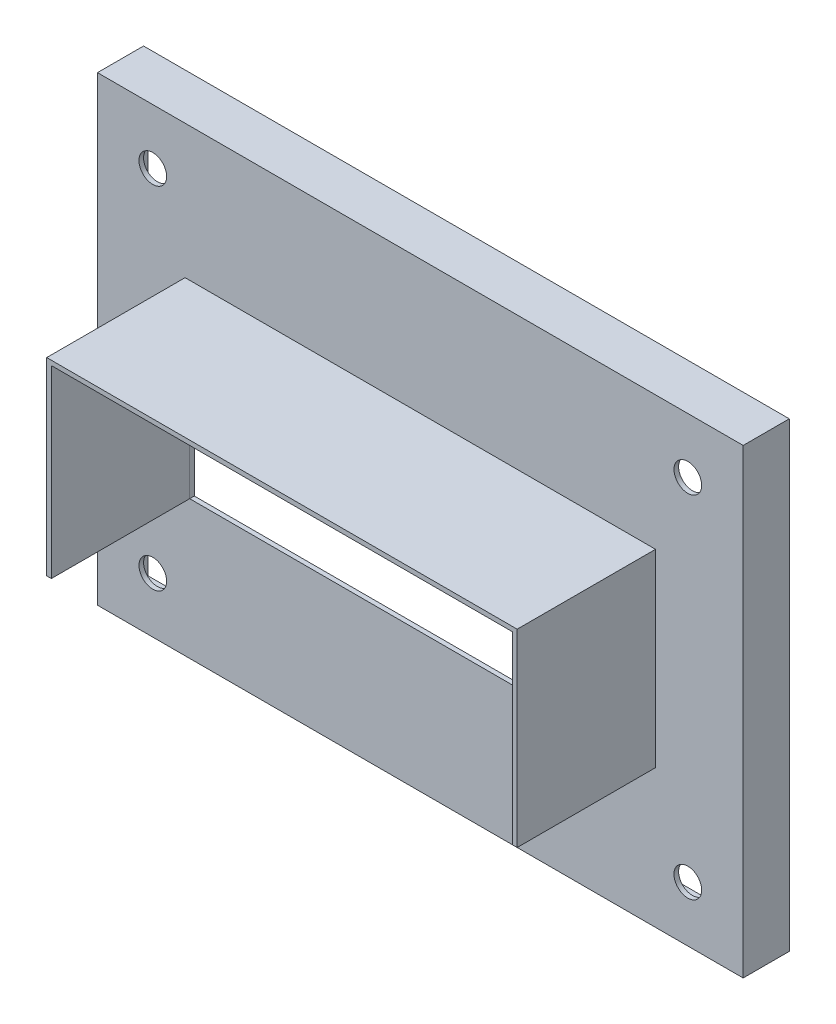
ISO-10303-21;
HEADER;
FILE_DESCRIPTION(('STEP AP214'),'2;1');
FILE_NAME('part.step','',(''),(''),'','','');
FILE_SCHEMA(('AUTOMOTIVE_DESIGN { 1 0 10303 214 1 1 1 1 }'));
ENDSEC;
DATA;
#1=APPLICATION_CONTEXT('core data for automotive mechanical design processes');
#2=APPLICATION_PROTOCOL_DEFINITION('international standard','automotive_design',2000,#1);
#3=PRODUCT_CONTEXT('',#1,'mechanical');
#4=PRODUCT('Part','Part','',(#3));
#5=PRODUCT_RELATED_PRODUCT_CATEGORY('part','',(#4));
#6=PRODUCT_DEFINITION_FORMATION('','',#4);
#7=PRODUCT_DEFINITION_CONTEXT('part definition',#1,'design');
#8=PRODUCT_DEFINITION('design','',#6,#7);
#9=PRODUCT_DEFINITION_SHAPE('','',#8);
#10=(LENGTH_UNIT() NAMED_UNIT(*) SI_UNIT(.MILLI.,.METRE.));
#11=(NAMED_UNIT(*) PLANE_ANGLE_UNIT() SI_UNIT($,.RADIAN.));
#12=(NAMED_UNIT(*) SI_UNIT($,.STERADIAN.) SOLID_ANGLE_UNIT());
#13=UNCERTAINTY_MEASURE_WITH_UNIT(LENGTH_MEASURE(1.E-05),#10,'distance_accuracy_value','');
#14=(GEOMETRIC_REPRESENTATION_CONTEXT(3) GLOBAL_UNCERTAINTY_ASSIGNED_CONTEXT((#13)) GLOBAL_UNIT_ASSIGNED_CONTEXT((#10,
#11,#12)) REPRESENTATION_CONTEXT('',''));
#15=CARTESIAN_POINT('',(0.,0.,0.));
#16=DIRECTION('',(0.,0.,1.));
#17=DIRECTION('',(1.,0.,0.));
#18=AXIS2_PLACEMENT_3D('',#15,#16,#17);
#19=CARTESIAN_POINT('',(-51.,-20.,30.));
#20=DIRECTION('',(0.,1.,0.));
#21=DIRECTION('',(0.,0.,1.));
#22=AXIS2_PLACEMENT_3D('',#19,#20,#21);
#23=PLANE('',#22);
#24=DIRECTION('',(1.,0.,0.));
#25=VECTOR('',#24,1.);
#26=CARTESIAN_POINT('',(-51.,-20.,0.));
#27=LINE('',#26,#25);
#28=CARTESIAN_POINT('',(-51.,-20.,0.));
#29=VERTEX_POINT('',#28);
#30=CARTESIAN_POINT('',(-50.,-20.,0.));
#31=VERTEX_POINT('',#30);
#32=EDGE_CURVE('E143',#29,#31,#27,.T.);
#33=ORIENTED_EDGE('',*,*,#32,.T.);
#34=DIRECTION('',(0.,0.,-1.));
#35=VECTOR('',#34,1.);
#36=CARTESIAN_POINT('',(-50.,-20.,30.));
#37=LINE('',#36,#35);
#38=CARTESIAN_POINT('',(-50.,-20.,30.));
#39=VERTEX_POINT('',#38);
#40=EDGE_CURVE('E12',#39,#31,#37,.T.);
#41=ORIENTED_EDGE('',*,*,#40,.F.);
#42=DIRECTION('',(1.,0.,0.));
#43=VECTOR('',#42,1.);
#44=CARTESIAN_POINT('',(-51.,-20.,30.));
#45=LINE('',#44,#43);
#46=CARTESIAN_POINT('',(-51.,-20.,30.));
#47=VERTEX_POINT('',#46);
#48=EDGE_CURVE('E157',#47,#39,#45,.T.);
#49=ORIENTED_EDGE('',*,*,#48,.F.);
#50=DIRECTION('',(0.,0.,-1.));
#51=VECTOR('',#50,1.);
#52=CARTESIAN_POINT('',(-51.,-20.,30.));
#53=LINE('',#52,#51);
#54=EDGE_CURVE('E139',#47,#29,#53,.T.);
#55=ORIENTED_EDGE('',*,*,#54,.T.);
#56=EDGE_LOOP('',(#33,#41,#49,#55));
#57=FACE_BOUND('',#56,.T.);
#58=ADVANCED_FACE('F47',(#57),#23,.F.);
#59=CARTESIAN_POINT('',(-50.,-20.,30.));
#60=DIRECTION('',(-1.,0.,0.));
#61=DIRECTION('',(0.,0.,1.));
#62=AXIS2_PLACEMENT_3D('',#59,#60,#61);
#63=PLANE('',#62);
#64=DIRECTION('',(0.,1.,0.));
#65=VECTOR('',#64,1.);
#66=CARTESIAN_POINT('',(-50.,-20.,0.));
#67=LINE('',#66,#65);
#68=CARTESIAN_POINT('',(-50.,20.,0.));
#69=VERTEX_POINT('',#68);
#70=EDGE_CURVE('E146',#31,#69,#67,.T.);
#71=ORIENTED_EDGE('',*,*,#70,.T.);
#72=DIRECTION('',(0.,0.,-1.));
#73=VECTOR('',#72,1.);
#74=CARTESIAN_POINT('',(-50.,20.,30.));
#75=LINE('',#74,#73);
#76=CARTESIAN_POINT('',(-50.,20.,30.));
#77=VERTEX_POINT('',#76);
#78=EDGE_CURVE('E55',#77,#69,#75,.T.);
#79=ORIENTED_EDGE('',*,*,#78,.F.);
#80=DIRECTION('',(0.,1.,0.));
#81=VECTOR('',#80,1.);
#82=CARTESIAN_POINT('',(-50.,-20.,30.));
#83=LINE('',#82,#81);
#84=EDGE_CURVE('E106',#39,#77,#83,.T.);
#85=ORIENTED_EDGE('',*,*,#84,.F.);
#86=ORIENTED_EDGE('',*,*,#40,.T.);
#87=EDGE_LOOP('',(#71,#79,#85,#86));
#88=FACE_BOUND('',#87,.T.);
#89=ADVANCED_FACE('F192',(#88),#63,.F.);
#90=CARTESIAN_POINT('',(-50.,20.,30.));
#91=DIRECTION('',(0.,1.,0.));
#92=DIRECTION('',(0.,0.,1.));
#93=AXIS2_PLACEMENT_3D('',#90,#91,#92);
#94=PLANE('',#93);
#95=DIRECTION('',(1.,0.,0.));
#96=VECTOR('',#95,1.);
#97=CARTESIAN_POINT('',(-50.,20.,0.));
#98=LINE('',#97,#96);
#99=CARTESIAN_POINT('',(50.,20.,0.));
#100=VERTEX_POINT('',#99);
#101=EDGE_CURVE('E148',#69,#100,#98,.T.);
#102=ORIENTED_EDGE('',*,*,#101,.T.);
#103=DIRECTION('',(0.,0.,-1.));
#104=VECTOR('',#103,1.);
#105=CARTESIAN_POINT('',(50.,20.,30.));
#106=LINE('',#105,#104);
#107=CARTESIAN_POINT('',(50.,20.,30.));
#108=VERTEX_POINT('',#107);
#109=EDGE_CURVE('E164',#108,#100,#106,.T.);
#110=ORIENTED_EDGE('',*,*,#109,.F.);
#111=DIRECTION('',(1.,0.,0.));
#112=VECTOR('',#111,1.);
#113=CARTESIAN_POINT('',(-50.,20.,30.));
#114=LINE('',#113,#112);
#115=EDGE_CURVE('E172',#77,#108,#114,.T.);
#116=ORIENTED_EDGE('',*,*,#115,.F.);
#117=ORIENTED_EDGE('',*,*,#78,.T.);
#118=EDGE_LOOP('',(#102,#110,#116,#117));
#119=FACE_BOUND('',#118,.T.);
#120=ADVANCED_FACE('F170',(#119),#94,.F.);
#121=CARTESIAN_POINT('',(50.,20.,30.));
#122=DIRECTION('',(1.,0.,0.));
#123=DIRECTION('',(0.,0.,-1.));
#124=AXIS2_PLACEMENT_3D('',#121,#122,#123);
#125=PLANE('',#124);
#126=DIRECTION('',(0.,-1.,0.));
#127=VECTOR('',#126,1.);
#128=CARTESIAN_POINT('',(50.,20.,0.));
#129=LINE('',#128,#127);
#130=CARTESIAN_POINT('',(50.,-20.,0.));
#131=VERTEX_POINT('',#130);
#132=EDGE_CURVE('E150',#100,#131,#129,.T.);
#133=ORIENTED_EDGE('',*,*,#132,.T.);
#134=DIRECTION('',(0.,0.,-1.));
#135=VECTOR('',#134,1.);
#136=CARTESIAN_POINT('',(50.,-20.,30.));
#137=LINE('',#136,#135);
#138=CARTESIAN_POINT('',(50.,-20.,30.));
#139=VERTEX_POINT('',#138);
#140=EDGE_CURVE('E161',#139,#131,#137,.T.);
#141=ORIENTED_EDGE('',*,*,#140,.F.);
#142=DIRECTION('',(0.,-1.,0.));
#143=VECTOR('',#142,1.);
#144=CARTESIAN_POINT('',(50.,20.,30.));
#145=LINE('',#144,#143);
#146=EDGE_CURVE('E184',#108,#139,#145,.T.);
#147=ORIENTED_EDGE('',*,*,#146,.F.);
#148=ORIENTED_EDGE('',*,*,#109,.T.);
#149=EDGE_LOOP('',(#133,#141,#147,#148));
#150=FACE_BOUND('',#149,.T.);
#151=ADVANCED_FACE('F180',(#150),#125,.F.);
#152=CARTESIAN_POINT('',(51.,-20.,30.));
#153=DIRECTION('',(0.,1.,0.));
#154=DIRECTION('',(0.,0.,1.));
#155=AXIS2_PLACEMENT_3D('',#152,#153,#154);
#156=PLANE('',#155);
#157=DIRECTION('',(1.,0.,0.));
#158=VECTOR('',#157,1.);
#159=CARTESIAN_POINT('',(51.,-20.,0.));
#160=LINE('',#159,#158);
#161=CARTESIAN_POINT('',(51.,-20.,0.));
#162=VERTEX_POINT('',#161);
#163=EDGE_CURVE('E152',#131,#162,#160,.T.);
#164=ORIENTED_EDGE('',*,*,#163,.T.);
#165=DIRECTION('',(0.,0.,-1.));
#166=VECTOR('',#165,1.);
#167=CARTESIAN_POINT('',(51.,-20.,30.));
#168=LINE('',#167,#166);
#169=CARTESIAN_POINT('',(51.,-20.,30.));
#170=VERTEX_POINT('',#169);
#171=EDGE_CURVE('E134',#170,#162,#168,.T.);
#172=ORIENTED_EDGE('',*,*,#171,.F.);
#173=DIRECTION('',(1.,0.,0.));
#174=VECTOR('',#173,1.);
#175=CARTESIAN_POINT('',(51.,-20.,30.));
#176=LINE('',#175,#174);
#177=EDGE_CURVE('E125',#139,#170,#176,.T.);
#178=ORIENTED_EDGE('',*,*,#177,.F.);
#179=ORIENTED_EDGE('',*,*,#140,.T.);
#180=EDGE_LOOP('',(#164,#172,#178,#179));
#181=FACE_BOUND('',#180,.T.);
#182=ADVANCED_FACE('F183',(#181),#156,.F.);
#183=CARTESIAN_POINT('',(51.,21.,30.));
#184=DIRECTION('',(-1.,0.,0.));
#185=DIRECTION('',(0.,0.,1.));
#186=AXIS2_PLACEMENT_3D('',#183,#184,#185);
#187=PLANE('',#186);
#188=DIRECTION('',(0.,1.,0.));
#189=VECTOR('',#188,1.);
#190=CARTESIAN_POINT('',(51.,21.,0.));
#191=LINE('',#190,#189);
#192=CARTESIAN_POINT('',(51.,21.,0.));
#193=VERTEX_POINT('',#192);
#194=EDGE_CURVE('E133',#162,#193,#191,.T.);
#195=ORIENTED_EDGE('',*,*,#194,.T.);
#196=DIRECTION('',(0.,0.,-1.));
#197=VECTOR('',#196,1.);
#198=CARTESIAN_POINT('',(51.,21.,30.));
#199=LINE('',#198,#197);
#200=CARTESIAN_POINT('',(51.,21.,30.));
#201=VERTEX_POINT('',#200);
#202=EDGE_CURVE('E130',#201,#193,#199,.T.);
#203=ORIENTED_EDGE('',*,*,#202,.F.);
#204=DIRECTION('',(0.,1.,0.));
#205=VECTOR('',#204,1.);
#206=CARTESIAN_POINT('',(51.,21.,30.));
#207=LINE('',#206,#205);
#208=EDGE_CURVE('E119',#170,#201,#207,.T.);
#209=ORIENTED_EDGE('',*,*,#208,.F.);
#210=ORIENTED_EDGE('',*,*,#171,.T.);
#211=EDGE_LOOP('',(#195,#203,#209,#210));
#212=FACE_BOUND('',#211,.T.);
#213=ADVANCED_FACE('F131',(#212),#187,.F.);
#214=CARTESIAN_POINT('',(-51.,21.,30.));
#215=DIRECTION('',(0.,-1.,0.));
#216=DIRECTION('',(0.,0.,-1.));
#217=AXIS2_PLACEMENT_3D('',#214,#215,#216);
#218=PLANE('',#217);
#219=DIRECTION('',(-1.,0.,0.));
#220=VECTOR('',#219,1.);
#221=CARTESIAN_POINT('',(-51.,21.,0.));
#222=LINE('',#221,#220);
#223=CARTESIAN_POINT('',(-51.,21.,0.));
#224=VERTEX_POINT('',#223);
#225=EDGE_CURVE('E92',#193,#224,#222,.T.);
#226=ORIENTED_EDGE('',*,*,#225,.T.);
#227=DIRECTION('',(0.,0.,-1.));
#228=VECTOR('',#227,1.);
#229=CARTESIAN_POINT('',(-51.,21.,30.));
#230=LINE('',#229,#228);
#231=CARTESIAN_POINT('',(-51.,21.,30.));
#232=VERTEX_POINT('',#231);
#233=EDGE_CURVE('E135',#232,#224,#230,.T.);
#234=ORIENTED_EDGE('',*,*,#233,.F.);
#235=DIRECTION('',(-1.,0.,0.));
#236=VECTOR('',#235,1.);
#237=CARTESIAN_POINT('',(-51.,21.,30.));
#238=LINE('',#237,#236);
#239=EDGE_CURVE('E123',#201,#232,#238,.T.);
#240=ORIENTED_EDGE('',*,*,#239,.F.);
#241=ORIENTED_EDGE('',*,*,#202,.T.);
#242=EDGE_LOOP('',(#226,#234,#240,#241));
#243=FACE_BOUND('',#242,.T.);
#244=ADVANCED_FACE('F137',(#243),#218,.F.);
#245=CARTESIAN_POINT('',(-51.,-20.,30.));
#246=DIRECTION('',(1.,0.,0.));
#247=DIRECTION('',(0.,0.,-1.));
#248=AXIS2_PLACEMENT_3D('',#245,#246,#247);
#249=PLANE('',#248);
#250=DIRECTION('',(0.,-1.,0.));
#251=VECTOR('',#250,1.);
#252=CARTESIAN_POINT('',(-51.,-20.,0.));
#253=LINE('',#252,#251);
#254=EDGE_CURVE('E98',#224,#29,#253,.T.);
#255=ORIENTED_EDGE('',*,*,#254,.T.);
#256=ORIENTED_EDGE('',*,*,#54,.F.);
#257=DIRECTION('',(0.,-1.,0.));
#258=VECTOR('',#257,1.);
#259=CARTESIAN_POINT('',(-51.,-20.,30.));
#260=LINE('',#259,#258);
#261=EDGE_CURVE('E63',#232,#47,#260,.T.);
#262=ORIENTED_EDGE('',*,*,#261,.F.);
#263=ORIENTED_EDGE('',*,*,#233,.T.);
#264=EDGE_LOOP('',(#255,#256,#262,#263));
#265=FACE_BOUND('',#264,.T.);
#266=ADVANCED_FACE('F208',(#265),#249,.F.);
#267=CARTESIAN_POINT('',(0.,0.,30.));
#268=DIRECTION('',(0.,0.,1.));
#269=DIRECTION('',(1.,0.,0.));
#270=AXIS2_PLACEMENT_3D('',#267,#268,#269);
#271=PLANE('',#270);
#272=ORIENTED_EDGE('',*,*,#48,.T.);
#273=ORIENTED_EDGE('',*,*,#84,.T.);
#274=ORIENTED_EDGE('',*,*,#115,.T.);
#275=ORIENTED_EDGE('',*,*,#146,.T.);
#276=ORIENTED_EDGE('',*,*,#177,.T.);
#277=ORIENTED_EDGE('',*,*,#208,.T.);
#278=ORIENTED_EDGE('',*,*,#239,.T.);
#279=ORIENTED_EDGE('',*,*,#261,.T.);
#280=EDGE_LOOP('',(#272,#273,#274,#275,#276,#277,#278,#279));
#281=FACE_BOUND('',#280,.T.);
#282=ADVANCED_FACE('F121',(#281),#271,.T.);
#283=CARTESIAN_POINT('',(0.,0.,0.));
#284=DIRECTION('',(0.,0.,1.));
#285=DIRECTION('',(1.,0.,0.));
#286=AXIS2_PLACEMENT_3D('',#283,#284,#285);
#287=PLANE('',#286);
#288=ORIENTED_EDGE('',*,*,#32,.F.);
#289=ORIENTED_EDGE('',*,*,#254,.F.);
#290=ORIENTED_EDGE('',*,*,#225,.F.);
#291=ORIENTED_EDGE('',*,*,#194,.F.);
#292=ORIENTED_EDGE('',*,*,#163,.F.);
#293=ORIENTED_EDGE('',*,*,#132,.F.);
#294=ORIENTED_EDGE('',*,*,#101,.F.);
#295=ORIENTED_EDGE('',*,*,#70,.F.);
#296=EDGE_LOOP('',(#288,#289,#290,#291,#292,#293,#294,#295));
#297=FACE_BOUND('',#296,.T.);
#298=ADVANCED_FACE('F176',(#297),#287,.F.);
#299=CLOSED_SHELL('',(#58,#89,#120,#151,#182,#213,#244,#266,#282,#298));
#300=MANIFOLD_SOLID_BREP('B2',#299);
#301=CARTESIAN_POINT('',(0.,0.,-1.));
#302=DIRECTION('',(0.,0.,-1.));
#303=DIRECTION('',(-1.,0.,0.));
#304=AXIS2_PLACEMENT_3D('',#301,#302,#303);
#305=PLANE('',#304);
#306=CARTESIAN_POINT('',(-58.,-38.,-1.));
#307=DIRECTION('',(0.,0.,1.));
#308=DIRECTION('',(-1.,0.,0.));
#309=AXIS2_PLACEMENT_3D('',#306,#307,#308);
#310=CIRCLE('',#309,3.);
#311=CARTESIAN_POINT('',(-61.,-38.,-1.));
#312=VERTEX_POINT('',#311);
#313=EDGE_CURVE('E405',#312,#312,#310,.T.);
#314=ORIENTED_EDGE('',*,*,#313,.T.);
#315=EDGE_LOOP('',(#314));
#316=FACE_BOUND('',#315,.T.);
#317=CARTESIAN_POINT('',(58.,-38.,-1.));
#318=DIRECTION('',(0.,0.,1.));
#319=DIRECTION('',(1.,0.,0.));
#320=AXIS2_PLACEMENT_3D('',#317,#318,#319);
#321=CIRCLE('',#320,3.);
#322=CARTESIAN_POINT('',(61.,-38.,-1.));
#323=VERTEX_POINT('',#322);
#324=EDGE_CURVE('E728',#323,#323,#321,.T.);
#325=ORIENTED_EDGE('',*,*,#324,.T.);
#326=EDGE_LOOP('',(#325));
#327=FACE_BOUND('',#326,.T.);
#328=CARTESIAN_POINT('',(58.,38.,-1.));
#329=DIRECTION('',(0.,0.,1.));
#330=DIRECTION('',(-1.,0.,0.));
#331=AXIS2_PLACEMENT_3D('',#328,#329,#330);
#332=CIRCLE('',#331,3.);
#333=CARTESIAN_POINT('',(55.,38.,-1.));
#334=VERTEX_POINT('',#333);
#335=EDGE_CURVE('E734',#334,#334,#332,.T.);
#336=ORIENTED_EDGE('',*,*,#335,.T.);
#337=EDGE_LOOP('',(#336));
#338=FACE_BOUND('',#337,.T.);
#339=CARTESIAN_POINT('',(-58.,38.,-1.));
#340=DIRECTION('',(0.,0.,1.));
#341=DIRECTION('',(1.,0.,0.));
#342=AXIS2_PLACEMENT_3D('',#339,#340,#341);
#343=CIRCLE('',#342,3.);
#344=CARTESIAN_POINT('',(-55.,38.,-1.));
#345=VERTEX_POINT('',#344);
#346=EDGE_CURVE('E421',#345,#345,#343,.T.);
#347=ORIENTED_EDGE('',*,*,#346,.T.);
#348=EDGE_LOOP('',(#347));
#349=FACE_BOUND('',#348,.T.);
#350=DIRECTION('',(0.,1.,0.));
#351=VECTOR('',#350,1.);
#352=CARTESIAN_POINT('',(69.,-49.,-1.));
#353=LINE('',#352,#351);
#354=CARTESIAN_POINT('',(69.,-49.,-0.999999999999999));
#355=VERTEX_POINT('',#354);
#356=CARTESIAN_POINT('',(69.,49.,-1.));
#357=VERTEX_POINT('',#356);
#358=EDGE_CURVE('E424',#355,#357,#353,.T.);
#359=ORIENTED_EDGE('',*,*,#358,.F.);
#360=DIRECTION('',(1.,0.,0.));
#361=VECTOR('',#360,1.);
#362=CARTESIAN_POINT('',(-69.,-49.,-1.));
#363=LINE('',#362,#361);
#364=CARTESIAN_POINT('',(-69.,-49.,-1.));
#365=VERTEX_POINT('',#364);
#366=EDGE_CURVE('E437',#365,#355,#363,.T.);
#367=ORIENTED_EDGE('',*,*,#366,.F.);
#368=DIRECTION('',(0.,-1.,0.));
#369=VECTOR('',#368,1.);
#370=CARTESIAN_POINT('',(-69.,-49.,-1.));
#371=LINE('',#370,#369);
#372=CARTESIAN_POINT('',(-69.,49.,-1.));
#373=VERTEX_POINT('',#372);
#374=EDGE_CURVE('E434',#373,#365,#371,.T.);
#375=ORIENTED_EDGE('',*,*,#374,.F.);
#376=DIRECTION('',(-1.,0.,0.));
#377=VECTOR('',#376,1.);
#378=CARTESIAN_POINT('',(-69.,49.,-1.));
#379=LINE('',#378,#377);
#380=EDGE_CURVE('E431',#357,#373,#379,.T.);
#381=ORIENTED_EDGE('',*,*,#380,.F.);
#382=EDGE_LOOP('',(#359,#367,#375,#381));
#383=FACE_BOUND('',#382,.T.);
#384=DIRECTION('',(1.,0.,0.));
#385=VECTOR('',#384,1.);
#386=CARTESIAN_POINT('',(-50.,-20.,-1.));
#387=LINE('',#386,#385);
#388=CARTESIAN_POINT('',(-50.,-20.,-1.));
#389=VERTEX_POINT('',#388);
#390=CARTESIAN_POINT('',(50.,-20.,-1.));
#391=VERTEX_POINT('',#390);
#392=EDGE_CURVE('E413',#389,#391,#387,.T.);
#393=ORIENTED_EDGE('',*,*,#392,.T.);
#394=DIRECTION('',(0.,1.,0.));
#395=VECTOR('',#394,1.);
#396=CARTESIAN_POINT('',(50.,-20.,-1.));
#397=LINE('',#396,#395);
#398=CARTESIAN_POINT('',(50.,20.,-1.));
#399=VERTEX_POINT('',#398);
#400=EDGE_CURVE('E386',#391,#399,#397,.T.);
#401=ORIENTED_EDGE('',*,*,#400,.T.);
#402=DIRECTION('',(-1.,0.,0.));
#403=VECTOR('',#402,1.);
#404=CARTESIAN_POINT('',(-50.,20.,-1.));
#405=LINE('',#404,#403);
#406=CARTESIAN_POINT('',(-50.,20.,-1.));
#407=VERTEX_POINT('',#406);
#408=EDGE_CURVE('E417',#399,#407,#405,.T.);
#409=ORIENTED_EDGE('',*,*,#408,.T.);
#410=DIRECTION('',(0.,-1.,0.));
#411=VECTOR('',#410,1.);
#412=CARTESIAN_POINT('',(-50.,-20.,-1.));
#413=LINE('',#412,#411);
#414=EDGE_CURVE('E319',#407,#389,#413,.T.);
#415=ORIENTED_EDGE('',*,*,#414,.T.);
#416=EDGE_LOOP('',(#393,#401,#409,#415));
#417=FACE_BOUND('',#416,.T.);
#418=ADVANCED_FACE('F294',(#316,#327,#338,#349,#383,#417),#305,.T.);
#419=CARTESIAN_POINT('',(70.,-50.,-10.));
#420=DIRECTION('',(1.,0.,0.));
#421=DIRECTION('',(0.,0.,-1.));
#422=AXIS2_PLACEMENT_3D('',#419,#420,#421);
#423=PLANE('',#422);
#424=DIRECTION('',(0.,1.,0.));
#425=VECTOR('',#424,1.);
#426=CARTESIAN_POINT('',(70.,-50.,0.));
#427=LINE('',#426,#425);
#428=CARTESIAN_POINT('',(70.,-50.,0.));
#429=VERTEX_POINT('',#428);
#430=CARTESIAN_POINT('',(70.,50.,0.));
#431=VERTEX_POINT('',#430);
#432=EDGE_CURVE('E456',#429,#431,#427,.T.);
#433=ORIENTED_EDGE('',*,*,#432,.F.);
#434=DIRECTION('',(0.,0.,1.));
#435=VECTOR('',#434,1.);
#436=CARTESIAN_POINT('',(70.,-50.,-10.));
#437=LINE('',#436,#435);
#438=CARTESIAN_POINT('',(70.,-50.,-10.));
#439=VERTEX_POINT('',#438);
#440=EDGE_CURVE('E45',#439,#429,#437,.T.);
#441=ORIENTED_EDGE('',*,*,#440,.F.);
#442=DIRECTION('',(0.,1.,0.));
#443=VECTOR('',#442,1.);
#444=CARTESIAN_POINT('',(70.,-50.,-10.));
#445=LINE('',#444,#443);
#446=CARTESIAN_POINT('',(70.,50.,-10.));
#447=VERTEX_POINT('',#446);
#448=EDGE_CURVE('E465',#439,#447,#445,.T.);
#449=ORIENTED_EDGE('',*,*,#448,.T.);
#450=DIRECTION('',(0.,0.,1.));
#451=VECTOR('',#450,1.);
#452=CARTESIAN_POINT('',(70.,50.,-10.));
#453=LINE('',#452,#451);
#454=EDGE_CURVE('E298',#447,#431,#453,.T.);
#455=ORIENTED_EDGE('',*,*,#454,.T.);
#456=EDGE_LOOP('',(#433,#441,#449,#455));
#457=FACE_BOUND('',#456,.T.);
#458=ADVANCED_FACE('F296',(#457),#423,.T.);
#459=CARTESIAN_POINT('',(-70.,-50.,-10.));
#460=DIRECTION('',(0.,-1.,0.));
#461=DIRECTION('',(0.,0.,-1.));
#462=AXIS2_PLACEMENT_3D('',#459,#460,#461);
#463=PLANE('',#462);
#464=DIRECTION('',(1.,0.,0.));
#465=VECTOR('',#464,1.);
#466=CARTESIAN_POINT('',(-70.,-50.,0.));
#467=LINE('',#466,#465);
#468=CARTESIAN_POINT('',(-70.,-50.,0.));
#469=VERTEX_POINT('',#468);
#470=EDGE_CURVE('E469',#469,#429,#467,.T.);
#471=ORIENTED_EDGE('',*,*,#470,.F.);
#472=DIRECTION('',(0.,0.,1.));
#473=VECTOR('',#472,1.);
#474=CARTESIAN_POINT('',(-70.,-50.,-10.));
#475=LINE('',#474,#473);
#476=CARTESIAN_POINT('',(-70.,-50.,-10.));
#477=VERTEX_POINT('',#476);
#478=EDGE_CURVE('E303',#477,#469,#475,.T.);
#479=ORIENTED_EDGE('',*,*,#478,.F.);
#480=DIRECTION('',(1.,0.,0.));
#481=VECTOR('',#480,1.);
#482=CARTESIAN_POINT('',(-70.,-50.,-10.));
#483=LINE('',#482,#481);
#484=EDGE_CURVE('E475',#477,#439,#483,.T.);
#485=ORIENTED_EDGE('',*,*,#484,.T.);
#486=ORIENTED_EDGE('',*,*,#440,.T.);
#487=EDGE_LOOP('',(#471,#479,#485,#486));
#488=FACE_BOUND('',#487,.T.);
#489=ADVANCED_FACE('F500',(#488),#463,.T.);
#490=CARTESIAN_POINT('',(-70.,-50.,-10.));
#491=DIRECTION('',(-1.,0.,0.));
#492=DIRECTION('',(0.,0.,1.));
#493=AXIS2_PLACEMENT_3D('',#490,#491,#492);
#494=PLANE('',#493);
#495=DIRECTION('',(0.,-1.,0.));
#496=VECTOR('',#495,1.);
#497=CARTESIAN_POINT('',(-70.,-50.,0.));
#498=LINE('',#497,#496);
#499=CARTESIAN_POINT('',(-70.,50.,0.));
#500=VERTEX_POINT('',#499);
#501=EDGE_CURVE('E483',#500,#469,#498,.T.);
#502=ORIENTED_EDGE('',*,*,#501,.F.);
#503=DIRECTION('',(0.,0.,1.));
#504=VECTOR('',#503,1.);
#505=CARTESIAN_POINT('',(-70.,50.,-10.));
#506=LINE('',#505,#504);
#507=CARTESIAN_POINT('',(-70.,50.,-10.));
#508=VERTEX_POINT('',#507);
#509=EDGE_CURVE('E488',#508,#500,#506,.T.);
#510=ORIENTED_EDGE('',*,*,#509,.F.);
#511=DIRECTION('',(0.,-1.,0.));
#512=VECTOR('',#511,1.);
#513=CARTESIAN_POINT('',(-70.,-50.,-10.));
#514=LINE('',#513,#512);
#515=EDGE_CURVE('E472',#508,#477,#514,.T.);
#516=ORIENTED_EDGE('',*,*,#515,.T.);
#517=ORIENTED_EDGE('',*,*,#478,.T.);
#518=EDGE_LOOP('',(#502,#510,#516,#517));
#519=FACE_BOUND('',#518,.T.);
#520=ADVANCED_FACE('F506',(#519),#494,.T.);
#521=CARTESIAN_POINT('',(-70.,50.,-10.));
#522=DIRECTION('',(0.,1.,0.));
#523=DIRECTION('',(0.,0.,1.));
#524=AXIS2_PLACEMENT_3D('',#521,#522,#523);
#525=PLANE('',#524);
#526=DIRECTION('',(-1.,0.,0.));
#527=VECTOR('',#526,1.);
#528=CARTESIAN_POINT('',(-70.,50.,0.));
#529=LINE('',#528,#527);
#530=EDGE_CURVE('E480',#431,#500,#529,.T.);
#531=ORIENTED_EDGE('',*,*,#530,.F.);
#532=ORIENTED_EDGE('',*,*,#454,.F.);
#533=DIRECTION('',(-1.,0.,0.));
#534=VECTOR('',#533,1.);
#535=CARTESIAN_POINT('',(-70.,50.,-10.));
#536=LINE('',#535,#534);
#537=EDGE_CURVE('E468',#447,#508,#536,.T.);
#538=ORIENTED_EDGE('',*,*,#537,.T.);
#539=ORIENTED_EDGE('',*,*,#509,.T.);
#540=EDGE_LOOP('',(#531,#532,#538,#539));
#541=FACE_BOUND('',#540,.T.);
#542=ADVANCED_FACE('F496',(#541),#525,.T.);
#543=CARTESIAN_POINT('',(0.,0.,-10.));
#544=DIRECTION('',(0.,0.,-1.));
#545=DIRECTION('',(-1.,0.,0.));
#546=AXIS2_PLACEMENT_3D('',#543,#544,#545);
#547=PLANE('',#546);
#548=DIRECTION('',(0.,-1.,0.));
#549=VECTOR('',#548,1.);
#550=CARTESIAN_POINT('',(-69.,-49.,-10.));
#551=LINE('',#550,#549);
#552=CARTESIAN_POINT('',(-69.,49.,-10.));
#553=VERTEX_POINT('',#552);
#554=CARTESIAN_POINT('',(-69.,-49.,-10.));
#555=VERTEX_POINT('',#554);
#556=EDGE_CURVE('E440',#553,#555,#551,.T.);
#557=ORIENTED_EDGE('',*,*,#556,.T.);
#558=DIRECTION('',(1.,0.,0.));
#559=VECTOR('',#558,1.);
#560=CARTESIAN_POINT('',(-69.,-49.,-10.));
#561=LINE('',#560,#559);
#562=CARTESIAN_POINT('',(69.,-49.,-10.));
#563=VERTEX_POINT('',#562);
#564=EDGE_CURVE('E443',#555,#563,#561,.T.);
#565=ORIENTED_EDGE('',*,*,#564,.T.);
#566=DIRECTION('',(0.,1.,0.));
#567=VECTOR('',#566,1.);
#568=CARTESIAN_POINT('',(69.,-49.,-10.));
#569=LINE('',#568,#567);
#570=CARTESIAN_POINT('',(69.,49.,-10.));
#571=VERTEX_POINT('',#570);
#572=EDGE_CURVE('E446',#563,#571,#569,.T.);
#573=ORIENTED_EDGE('',*,*,#572,.T.);
#574=DIRECTION('',(-1.,0.,0.));
#575=VECTOR('',#574,1.);
#576=CARTESIAN_POINT('',(-69.,49.,-10.));
#577=LINE('',#576,#575);
#578=EDGE_CURVE('E449',#571,#553,#577,.T.);
#579=ORIENTED_EDGE('',*,*,#578,.T.);
#580=EDGE_LOOP('',(#557,#565,#573,#579));
#581=FACE_BOUND('',#580,.T.);
#582=ORIENTED_EDGE('',*,*,#448,.F.);
#583=ORIENTED_EDGE('',*,*,#484,.F.);
#584=ORIENTED_EDGE('',*,*,#515,.F.);
#585=ORIENTED_EDGE('',*,*,#537,.F.);
#586=EDGE_LOOP('',(#582,#583,#584,#585));
#587=FACE_BOUND('',#586,.T.);
#588=ADVANCED_FACE('F503',(#581,#587),#547,.T.);
#589=CARTESIAN_POINT('',(0.,0.,0.));
#590=DIRECTION('',(0.,0.,-1.));
#591=DIRECTION('',(-1.,0.,0.));
#592=AXIS2_PLACEMENT_3D('',#589,#590,#591);
#593=PLANE('',#592);
#594=DIRECTION('',(-1.,0.,0.));
#595=VECTOR('',#594,1.);
#596=CARTESIAN_POINT('',(-50.,20.,0.));
#597=LINE('',#596,#595);
#598=CARTESIAN_POINT('',(50.,20.,0.));
#599=VERTEX_POINT('',#598);
#600=CARTESIAN_POINT('',(-50.,20.,0.));
#601=VERTEX_POINT('',#600);
#602=EDGE_CURVE('E404',#599,#601,#597,.T.);
#603=ORIENTED_EDGE('',*,*,#602,.F.);
#604=DIRECTION('',(0.,1.,0.));
#605=VECTOR('',#604,1.);
#606=CARTESIAN_POINT('',(50.,-20.,0.));
#607=LINE('',#606,#605);
#608=CARTESIAN_POINT('',(50.,-20.,0.));
#609=VERTEX_POINT('',#608);
#610=EDGE_CURVE('E311',#609,#599,#607,.T.);
#611=ORIENTED_EDGE('',*,*,#610,.F.);
#612=DIRECTION('',(1.,0.,0.));
#613=VECTOR('',#612,1.);
#614=CARTESIAN_POINT('',(-50.,-20.,0.));
#615=LINE('',#614,#613);
#616=CARTESIAN_POINT('',(-50.,-20.,0.));
#617=VERTEX_POINT('',#616);
#618=EDGE_CURVE('E393',#617,#609,#615,.T.);
#619=ORIENTED_EDGE('',*,*,#618,.F.);
#620=DIRECTION('',(0.,-1.,0.));
#621=VECTOR('',#620,1.);
#622=CARTESIAN_POINT('',(-50.,-20.,0.));
#623=LINE('',#622,#621);
#624=EDGE_CURVE('E398',#601,#617,#623,.T.);
#625=ORIENTED_EDGE('',*,*,#624,.F.);
#626=EDGE_LOOP('',(#603,#611,#619,#625));
#627=FACE_BOUND('',#626,.T.);
#628=CARTESIAN_POINT('',(-58.,-38.,0.));
#629=DIRECTION('',(0.,0.,1.));
#630=DIRECTION('',(-1.,0.,0.));
#631=AXIS2_PLACEMENT_3D('',#628,#629,#630);
#632=CIRCLE('',#631,3.);
#633=CARTESIAN_POINT('',(-61.,-38.,0.));
#634=VERTEX_POINT('',#633);
#635=EDGE_CURVE('E408',#634,#634,#632,.T.);
#636=ORIENTED_EDGE('',*,*,#635,.F.);
#637=EDGE_LOOP('',(#636));
#638=FACE_BOUND('',#637,.T.);
#639=CARTESIAN_POINT('',(58.,-38.,0.));
#640=DIRECTION('',(0.,0.,1.));
#641=DIRECTION('',(1.,0.,0.));
#642=AXIS2_PLACEMENT_3D('',#639,#640,#641);
#643=CIRCLE('',#642,3.);
#644=CARTESIAN_POINT('',(61.,-38.,0.));
#645=VERTEX_POINT('',#644);
#646=EDGE_CURVE('E731',#645,#645,#643,.T.);
#647=ORIENTED_EDGE('',*,*,#646,.F.);
#648=EDGE_LOOP('',(#647));
#649=FACE_BOUND('',#648,.T.);
#650=CARTESIAN_POINT('',(58.,38.,0.));
#651=DIRECTION('',(0.,0.,1.));
#652=DIRECTION('',(-1.,0.,0.));
#653=AXIS2_PLACEMENT_3D('',#650,#651,#652);
#654=CIRCLE('',#653,3.);
#655=CARTESIAN_POINT('',(55.,38.,0.));
#656=VERTEX_POINT('',#655);
#657=EDGE_CURVE('E428',#656,#656,#654,.T.);
#658=ORIENTED_EDGE('',*,*,#657,.F.);
#659=EDGE_LOOP('',(#658));
#660=FACE_BOUND('',#659,.T.);
#661=CARTESIAN_POINT('',(-58.,38.,0.));
#662=DIRECTION('',(0.,0.,1.));
#663=DIRECTION('',(1.,0.,0.));
#664=AXIS2_PLACEMENT_3D('',#661,#662,#663);
#665=CIRCLE('',#664,3.);
#666=CARTESIAN_POINT('',(-55.,38.,0.));
#667=VERTEX_POINT('',#666);
#668=EDGE_CURVE('E425',#667,#667,#665,.T.);
#669=ORIENTED_EDGE('',*,*,#668,.F.);
#670=EDGE_LOOP('',(#669));
#671=FACE_BOUND('',#670,.T.);
#672=ORIENTED_EDGE('',*,*,#432,.T.);
#673=ORIENTED_EDGE('',*,*,#530,.T.);
#674=ORIENTED_EDGE('',*,*,#501,.T.);
#675=ORIENTED_EDGE('',*,*,#470,.T.);
#676=EDGE_LOOP('',(#672,#673,#674,#675));
#677=FACE_BOUND('',#676,.T.);
#678=ADVANCED_FACE('F401',(#627,#638,#649,#660,#671,#677),#593,.F.);
#679=CARTESIAN_POINT('',(-69.,-49.,-10.));
#680=DIRECTION('',(-1.,0.,0.));
#681=DIRECTION('',(0.,0.,1.));
#682=AXIS2_PLACEMENT_3D('',#679,#680,#681);
#683=PLANE('',#682);
#684=DIRECTION('',(0.,0.,1.));
#685=VECTOR('',#684,1.);
#686=CARTESIAN_POINT('',(-69.,49.,-10.));
#687=LINE('',#686,#685);
#688=EDGE_CURVE('E453',#553,#373,#687,.T.);
#689=ORIENTED_EDGE('',*,*,#688,.T.);
#690=ORIENTED_EDGE('',*,*,#374,.T.);
#691=DIRECTION('',(0.,0.,1.));
#692=VECTOR('',#691,1.);
#693=CARTESIAN_POINT('',(-69.,-49.,-10.));
#694=LINE('',#693,#692);
#695=EDGE_CURVE('E452',#555,#365,#694,.T.);
#696=ORIENTED_EDGE('',*,*,#695,.F.);
#697=ORIENTED_EDGE('',*,*,#556,.F.);
#698=EDGE_LOOP('',(#689,#690,#696,#697));
#699=FACE_BOUND('',#698,.T.);
#700=ADVANCED_FACE('F531',(#699),#683,.F.);
#701=CARTESIAN_POINT('',(-69.,49.,-10.));
#702=DIRECTION('',(0.,1.,0.));
#703=DIRECTION('',(0.,0.,1.));
#704=AXIS2_PLACEMENT_3D('',#701,#702,#703);
#705=PLANE('',#704);
#706=DIRECTION('',(0.,0.,1.));
#707=VECTOR('',#706,1.);
#708=CARTESIAN_POINT('',(69.,49.,-10.));
#709=LINE('',#708,#707);
#710=EDGE_CURVE('E457',#571,#357,#709,.T.);
#711=ORIENTED_EDGE('',*,*,#710,.T.);
#712=ORIENTED_EDGE('',*,*,#380,.T.);
#713=ORIENTED_EDGE('',*,*,#688,.F.);
#714=ORIENTED_EDGE('',*,*,#578,.F.);
#715=EDGE_LOOP('',(#711,#712,#713,#714));
#716=FACE_BOUND('',#715,.T.);
#717=ADVANCED_FACE('F527',(#716),#705,.F.);
#718=CARTESIAN_POINT('',(69.,-49.,-10.));
#719=DIRECTION('',(1.,0.,0.));
#720=DIRECTION('',(0.,0.,-1.));
#721=AXIS2_PLACEMENT_3D('',#718,#719,#720);
#722=PLANE('',#721);
#723=DIRECTION('',(0.,0.,1.));
#724=VECTOR('',#723,1.);
#725=CARTESIAN_POINT('',(69.,-49.,-10.));
#726=LINE('',#725,#724);
#727=EDGE_CURVE('E460',#563,#355,#726,.T.);
#728=ORIENTED_EDGE('',*,*,#727,.T.);
#729=ORIENTED_EDGE('',*,*,#358,.T.);
#730=ORIENTED_EDGE('',*,*,#710,.F.);
#731=ORIENTED_EDGE('',*,*,#572,.F.);
#732=EDGE_LOOP('',(#728,#729,#730,#731));
#733=FACE_BOUND('',#732,.T.);
#734=ADVANCED_FACE('F530',(#733),#722,.F.);
#735=CARTESIAN_POINT('',(-69.,-49.,-10.));
#736=DIRECTION('',(0.,-1.,0.));
#737=DIRECTION('',(0.,0.,-1.));
#738=AXIS2_PLACEMENT_3D('',#735,#736,#737);
#739=PLANE('',#738);
#740=ORIENTED_EDGE('',*,*,#695,.T.);
#741=ORIENTED_EDGE('',*,*,#366,.T.);
#742=ORIENTED_EDGE('',*,*,#727,.F.);
#743=ORIENTED_EDGE('',*,*,#564,.F.);
#744=EDGE_LOOP('',(#740,#741,#742,#743));
#745=FACE_BOUND('',#744,.T.);
#746=ADVANCED_FACE('F535',(#745),#739,.F.);
#747=CARTESIAN_POINT('',(-58.,38.,-1.));
#748=DIRECTION('',(0.,0.,1.));
#749=DIRECTION('',(1.,0.,0.));
#750=AXIS2_PLACEMENT_3D('',#747,#748,#749);
#751=CYLINDRICAL_SURFACE('',#750,3.);
#752=ORIENTED_EDGE('',*,*,#346,.F.);
#753=EDGE_LOOP('',(#752));
#754=FACE_BOUND('',#753,.T.);
#755=ORIENTED_EDGE('',*,*,#668,.T.);
#756=EDGE_LOOP('',(#755));
#757=FACE_BOUND('',#756,.T.);
#758=ADVANCED_FACE('F525',(#754,#757),#751,.F.);
#759=CARTESIAN_POINT('',(58.,38.,-1.));
#760=DIRECTION('',(0.,0.,1.));
#761=DIRECTION('',(1.,0.,0.));
#762=AXIS2_PLACEMENT_3D('',#759,#760,#761);
#763=CYLINDRICAL_SURFACE('',#762,3.);
#764=ORIENTED_EDGE('',*,*,#335,.F.);
#765=EDGE_LOOP('',(#764));
#766=FACE_BOUND('',#765,.T.);
#767=ORIENTED_EDGE('',*,*,#657,.T.);
#768=EDGE_LOOP('',(#767));
#769=FACE_BOUND('',#768,.T.);
#770=ADVANCED_FACE('F555',(#766,#769),#763,.F.);
#771=CARTESIAN_POINT('',(58.,-38.,-1.));
#772=DIRECTION('',(0.,0.,1.));
#773=DIRECTION('',(1.,0.,0.));
#774=AXIS2_PLACEMENT_3D('',#771,#772,#773);
#775=CYLINDRICAL_SURFACE('',#774,3.);
#776=ORIENTED_EDGE('',*,*,#324,.F.);
#777=EDGE_LOOP('',(#776));
#778=FACE_BOUND('',#777,.T.);
#779=ORIENTED_EDGE('',*,*,#646,.T.);
#780=EDGE_LOOP('',(#779));
#781=FACE_BOUND('',#780,.T.);
#782=ADVANCED_FACE('F567',(#778,#781),#775,.F.);
#783=CARTESIAN_POINT('',(-58.,-38.,-1.));
#784=DIRECTION('',(0.,0.,1.));
#785=DIRECTION('',(1.,0.,0.));
#786=AXIS2_PLACEMENT_3D('',#783,#784,#785);
#787=CYLINDRICAL_SURFACE('',#786,3.);
#788=ORIENTED_EDGE('',*,*,#313,.F.);
#789=EDGE_LOOP('',(#788));
#790=FACE_BOUND('',#789,.T.);
#791=ORIENTED_EDGE('',*,*,#635,.T.);
#792=EDGE_LOOP('',(#791));
#793=FACE_BOUND('',#792,.T.);
#794=ADVANCED_FACE('F578',(#790,#793),#787,.F.);
#795=CARTESIAN_POINT('',(50.,-20.,-1.));
#796=DIRECTION('',(1.,0.,0.));
#797=DIRECTION('',(0.,0.,-1.));
#798=AXIS2_PLACEMENT_3D('',#795,#796,#797);
#799=PLANE('',#798);
#800=ORIENTED_EDGE('',*,*,#610,.T.);
#801=DIRECTION('',(0.,0.,1.));
#802=VECTOR('',#801,1.);
#803=CARTESIAN_POINT('',(50.,20.,-1.));
#804=LINE('',#803,#802);
#805=EDGE_CURVE('E415',#399,#599,#804,.T.);
#806=ORIENTED_EDGE('',*,*,#805,.F.);
#807=ORIENTED_EDGE('',*,*,#400,.F.);
#808=DIRECTION('',(0.,0.,1.));
#809=VECTOR('',#808,1.);
#810=CARTESIAN_POINT('',(50.,-20.,-1.));
#811=LINE('',#810,#809);
#812=EDGE_CURVE('E382',#391,#609,#811,.T.);
#813=ORIENTED_EDGE('',*,*,#812,.T.);
#814=EDGE_LOOP('',(#800,#806,#807,#813));
#815=FACE_BOUND('',#814,.T.);
#816=ADVANCED_FACE('F384',(#815),#799,.F.);
#817=CARTESIAN_POINT('',(-50.,-20.,-1.));
#818=DIRECTION('',(0.,-1.,0.));
#819=DIRECTION('',(0.,0.,-1.));
#820=AXIS2_PLACEMENT_3D('',#817,#818,#819);
#821=PLANE('',#820);
#822=ORIENTED_EDGE('',*,*,#618,.T.);
#823=ORIENTED_EDGE('',*,*,#812,.F.);
#824=ORIENTED_EDGE('',*,*,#392,.F.);
#825=DIRECTION('',(0.,0.,1.));
#826=VECTOR('',#825,1.);
#827=CARTESIAN_POINT('',(-50.,-20.,-1.));
#828=LINE('',#827,#826);
#829=EDGE_CURVE('E390',#389,#617,#828,.T.);
#830=ORIENTED_EDGE('',*,*,#829,.T.);
#831=EDGE_LOOP('',(#822,#823,#824,#830));
#832=FACE_BOUND('',#831,.T.);
#833=ADVANCED_FACE('F394',(#832),#821,.F.);
#834=CARTESIAN_POINT('',(-50.,-20.,-1.));
#835=DIRECTION('',(-1.,0.,0.));
#836=DIRECTION('',(0.,0.,1.));
#837=AXIS2_PLACEMENT_3D('',#834,#835,#836);
#838=PLANE('',#837);
#839=ORIENTED_EDGE('',*,*,#624,.T.);
#840=ORIENTED_EDGE('',*,*,#829,.F.);
#841=ORIENTED_EDGE('',*,*,#414,.F.);
#842=DIRECTION('',(0.,0.,1.));
#843=VECTOR('',#842,1.);
#844=CARTESIAN_POINT('',(-50.,20.,-1.));
#845=LINE('',#844,#843);
#846=EDGE_CURVE('E721',#407,#601,#845,.T.);
#847=ORIENTED_EDGE('',*,*,#846,.T.);
#848=EDGE_LOOP('',(#839,#840,#841,#847));
#849=FACE_BOUND('',#848,.T.);
#850=ADVANCED_FACE('F608',(#849),#838,.F.);
#851=CARTESIAN_POINT('',(-50.,20.,-1.));
#852=DIRECTION('',(0.,1.,0.));
#853=DIRECTION('',(0.,0.,1.));
#854=AXIS2_PLACEMENT_3D('',#851,#852,#853);
#855=PLANE('',#854);
#856=ORIENTED_EDGE('',*,*,#602,.T.);
#857=ORIENTED_EDGE('',*,*,#846,.F.);
#858=ORIENTED_EDGE('',*,*,#408,.F.);
#859=ORIENTED_EDGE('',*,*,#805,.T.);
#860=EDGE_LOOP('',(#856,#857,#858,#859));
#861=FACE_BOUND('',#860,.T.);
#862=ADVANCED_FACE('F617',(#861),#855,.F.);
#863=CLOSED_SHELL('',(#418,#458,#489,#520,#542,#588,#678,#700,#717,#734,#746,#758,#770,#782,
#794,#816,#833,#850,#862));
#864=MANIFOLD_SOLID_BREP('B6',#863);
#865=ADVANCED_BREP_SHAPE_REPRESENTATION('',(#18,#300,#864),#14);
#866=SHAPE_DEFINITION_REPRESENTATION(#9,#865);
ENDSEC;
END-ISO-10303-21;
